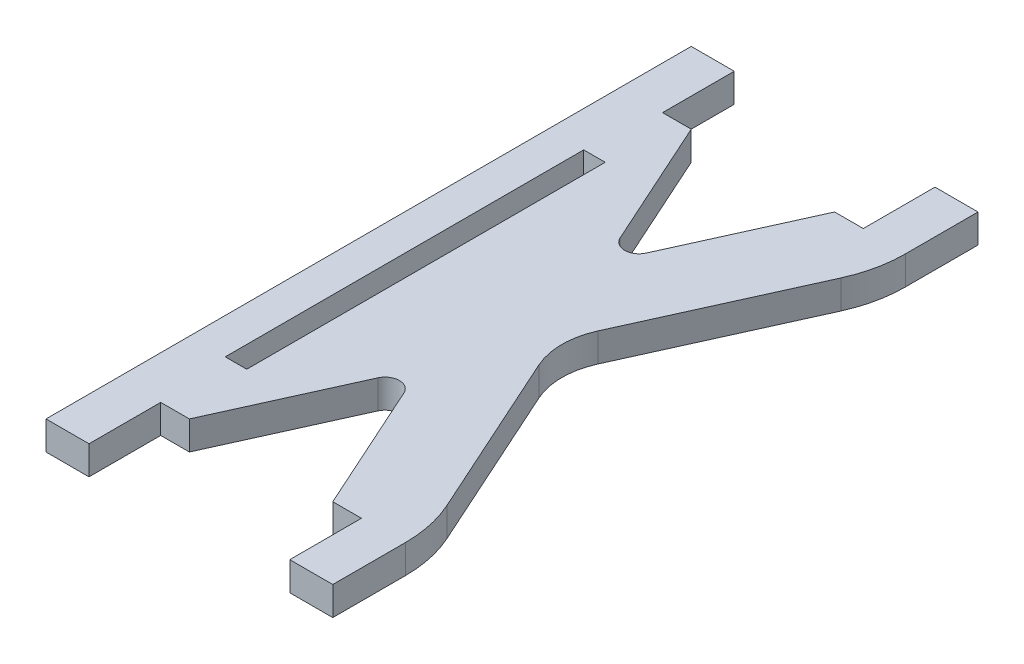
ISO-10303-21;
HEADER;
FILE_DESCRIPTION(('STEP AP214'),'2;1');
FILE_NAME('part.step','',(''),(''),'','','');
FILE_SCHEMA(('AUTOMOTIVE_DESIGN { 1 0 10303 214 1 1 1 1 }'));
ENDSEC;
DATA;
#1=APPLICATION_CONTEXT('core data for automotive mechanical design processes');
#2=APPLICATION_PROTOCOL_DEFINITION('international standard','automotive_design',2000,#1);
#3=PRODUCT_CONTEXT('',#1,'mechanical');
#4=PRODUCT('Part','Part','',(#3));
#5=PRODUCT_RELATED_PRODUCT_CATEGORY('part','',(#4));
#6=PRODUCT_DEFINITION_FORMATION('','',#4);
#7=PRODUCT_DEFINITION_CONTEXT('part definition',#1,'design');
#8=PRODUCT_DEFINITION('design','',#6,#7);
#9=PRODUCT_DEFINITION_SHAPE('','',#8);
#10=(LENGTH_UNIT() NAMED_UNIT(*) SI_UNIT(.MILLI.,.METRE.));
#11=(NAMED_UNIT(*) PLANE_ANGLE_UNIT() SI_UNIT($,.RADIAN.));
#12=(NAMED_UNIT(*) SI_UNIT($,.STERADIAN.) SOLID_ANGLE_UNIT());
#13=UNCERTAINTY_MEASURE_WITH_UNIT(LENGTH_MEASURE(1.E-05),#10,'distance_accuracy_value','');
#14=(GEOMETRIC_REPRESENTATION_CONTEXT(3) GLOBAL_UNCERTAINTY_ASSIGNED_CONTEXT((#13)) GLOBAL_UNIT_ASSIGNED_CONTEXT((#10,
#11,#12)) REPRESENTATION_CONTEXT('',''));
#15=CARTESIAN_POINT('',(0.,0.,0.));
#16=DIRECTION('',(0.,0.,1.));
#17=DIRECTION('',(1.,0.,0.));
#18=AXIS2_PLACEMENT_3D('',#15,#16,#17);
#19=CARTESIAN_POINT('',(0.,2.,5.));
#20=DIRECTION('',(0.,0.,-1.));
#21=DIRECTION('',(-1.,0.,0.));
#22=AXIS2_PLACEMENT_3D('',#19,#20,#21);
#23=PLANE('',#22);
#24=DIRECTION('',(1.,0.,0.));
#25=VECTOR('',#24,1.);
#26=CARTESIAN_POINT('',(0.,0.,5.));
#27=LINE('',#26,#25);
#28=CARTESIAN_POINT('',(0.,0.,5.));
#29=VERTEX_POINT('',#28);
#30=CARTESIAN_POINT('',(3.,0.,5.));
#31=VERTEX_POINT('',#30);
#32=EDGE_CURVE('E264',#29,#31,#27,.T.);
#33=ORIENTED_EDGE('',*,*,#32,.T.);
#34=DIRECTION('',(0.,-1.,0.));
#35=VECTOR('',#34,1.);
#36=CARTESIAN_POINT('',(3.,2.,5.));
#37=LINE('',#36,#35);
#38=CARTESIAN_POINT('',(3.,2.,5.));
#39=VERTEX_POINT('',#38);
#40=EDGE_CURVE('E403',#39,#31,#37,.T.);
#41=ORIENTED_EDGE('',*,*,#40,.F.);
#42=DIRECTION('',(1.,0.,0.));
#43=VECTOR('',#42,1.);
#44=CARTESIAN_POINT('',(0.,2.,5.));
#45=LINE('',#44,#43);
#46=CARTESIAN_POINT('',(0.,2.,5.));
#47=VERTEX_POINT('',#46);
#48=EDGE_CURVE('E268',#47,#39,#45,.T.);
#49=ORIENTED_EDGE('',*,*,#48,.F.);
#50=DIRECTION('',(0.,-1.,0.));
#51=VECTOR('',#50,1.);
#52=CARTESIAN_POINT('',(0.,2.,5.));
#53=LINE('',#52,#51);
#54=EDGE_CURVE('E406',#47,#29,#53,.T.);
#55=ORIENTED_EDGE('',*,*,#54,.T.);
#56=EDGE_LOOP('',(#33,#41,#49,#55));
#57=FACE_BOUND('',#56,.T.);
#58=ADVANCED_FACE('F35',(#57),#23,.F.);
#59=CARTESIAN_POINT('',(3.,2.,0.));
#60=DIRECTION('',(-1.,0.,0.));
#61=DIRECTION('',(0.,0.,1.));
#62=AXIS2_PLACEMENT_3D('',#59,#60,#61);
#63=PLANE('',#62);
#64=DIRECTION('',(0.,0.,-1.));
#65=VECTOR('',#64,1.);
#66=CARTESIAN_POINT('',(3.,0.,0.));
#67=LINE('',#66,#65);
#68=CARTESIAN_POINT('',(3.,0.,0.));
#69=VERTEX_POINT('',#68);
#70=EDGE_CURVE('E317',#31,#69,#67,.T.);
#71=ORIENTED_EDGE('',*,*,#70,.T.);
#72=DIRECTION('',(0.,-1.,0.));
#73=VECTOR('',#72,1.);
#74=CARTESIAN_POINT('',(3.,2.,0.));
#75=LINE('',#74,#73);
#76=CARTESIAN_POINT('',(3.,2.,0.));
#77=VERTEX_POINT('',#76);
#78=EDGE_CURVE('E400',#77,#69,#75,.T.);
#79=ORIENTED_EDGE('',*,*,#78,.F.);
#80=DIRECTION('',(0.,0.,-1.));
#81=VECTOR('',#80,1.);
#82=CARTESIAN_POINT('',(3.,2.,0.));
#83=LINE('',#82,#81);
#84=EDGE_CURVE('E270',#39,#77,#83,.T.);
#85=ORIENTED_EDGE('',*,*,#84,.F.);
#86=ORIENTED_EDGE('',*,*,#40,.T.);
#87=EDGE_LOOP('',(#71,#79,#85,#86));
#88=FACE_BOUND('',#87,.T.);
#89=ADVANCED_FACE('F536',(#88),#63,.F.);
#90=CARTESIAN_POINT('',(3.,2.,0.));
#91=DIRECTION('',(0.,0.,-1.));
#92=DIRECTION('',(-1.,0.,0.));
#93=AXIS2_PLACEMENT_3D('',#90,#91,#92);
#94=PLANE('',#93);
#95=DIRECTION('',(1.,0.,0.));
#96=VECTOR('',#95,1.);
#97=CARTESIAN_POINT('',(3.,0.,0.));
#98=LINE('',#97,#96);
#99=CARTESIAN_POINT('',(5.,0.,0.));
#100=VERTEX_POINT('',#99);
#101=EDGE_CURVE('E319',#69,#100,#98,.T.);
#102=ORIENTED_EDGE('',*,*,#101,.T.);
#103=DIRECTION('',(0.,-1.,0.));
#104=VECTOR('',#103,1.);
#105=CARTESIAN_POINT('',(5.,2.,0.));
#106=LINE('',#105,#104);
#107=CARTESIAN_POINT('',(5.,2.,0.));
#108=VERTEX_POINT('',#107);
#109=EDGE_CURVE('E397',#108,#100,#106,.T.);
#110=ORIENTED_EDGE('',*,*,#109,.F.);
#111=DIRECTION('',(1.,0.,0.));
#112=VECTOR('',#111,1.);
#113=CARTESIAN_POINT('',(3.,2.,0.));
#114=LINE('',#113,#112);
#115=EDGE_CURVE('E273',#77,#108,#114,.T.);
#116=ORIENTED_EDGE('',*,*,#115,.F.);
#117=ORIENTED_EDGE('',*,*,#78,.T.);
#118=EDGE_LOOP('',(#102,#110,#116,#117));
#119=FACE_BOUND('',#118,.T.);
#120=ADVANCED_FACE('F540',(#119),#94,.F.);
#121=CARTESIAN_POINT('',(5.,2.,0.));
#122=DIRECTION('',(-0.911370599658675,0.,-0.411586722426499));
#123=DIRECTION('',(-0.411586722426499,0.,0.911370599658675));
#124=AXIS2_PLACEMENT_3D('',#121,#122,#123);
#125=PLANE('',#124);
#126=DIRECTION('',(0.411586722426499,0.,-0.911370599658675));
#127=VECTOR('',#126,1.);
#128=CARTESIAN_POINT('',(5.,0.,0.));
#129=LINE('',#128,#127);
#130=CARTESIAN_POINT('',(9.08862940034133,0.,-9.05339367218436));
#131=VERTEX_POINT('',#130);
#132=EDGE_CURVE('E321',#100,#131,#129,.T.);
#133=ORIENTED_EDGE('',*,*,#132,.T.);
#134=DIRECTION('',(0.,-1.,0.));
#135=VECTOR('',#134,1.);
#136=CARTESIAN_POINT('',(9.08862940034133,2.,-9.05339367218436));
#137=LINE('',#136,#135);
#138=CARTESIAN_POINT('',(9.08862940034133,2.,-9.05339367218436));
#139=VERTEX_POINT('',#138);
#140=EDGE_CURVE('E412',#131,#139,#137,.F.);
#141=ORIENTED_EDGE('',*,*,#140,.T.);
#142=DIRECTION('',(0.411586722426499,0.,-0.911370599658675));
#143=VECTOR('',#142,1.);
#144=CARTESIAN_POINT('',(5.,2.,0.));
#145=LINE('',#144,#143);
#146=EDGE_CURVE('E275',#108,#139,#145,.T.);
#147=ORIENTED_EDGE('',*,*,#146,.F.);
#148=ORIENTED_EDGE('',*,*,#109,.T.);
#149=EDGE_LOOP('',(#133,#141,#147,#148));
#150=FACE_BOUND('',#149,.T.);
#151=ADVANCED_FACE('F544',(#150),#125,.F.);
#152=CARTESIAN_POINT('',(15.,2.,0.));
#153=DIRECTION('',(0.911370599658675,0.,-0.411586722426499));
#154=DIRECTION('',(-0.411586722426499,0.,-0.911370599658675));
#155=AXIS2_PLACEMENT_3D('',#152,#153,#154);
#156=PLANE('',#155);
#157=DIRECTION('',(0.411586722426499,0.,0.911370599658675));
#158=VECTOR('',#157,1.);
#159=CARTESIAN_POINT('',(15.,2.,0.));
#160=LINE('',#159,#158);
#161=CARTESIAN_POINT('',(10.9113705996587,2.,-9.05339367218436));
#162=VERTEX_POINT('',#161);
#163=CARTESIAN_POINT('',(15.,2.,0.));
#164=VERTEX_POINT('',#163);
#165=EDGE_CURVE('E278',#162,#164,#160,.T.);
#166=ORIENTED_EDGE('',*,*,#165,.F.);
#167=DIRECTION('',(0.,-1.,0.));
#168=VECTOR('',#167,1.);
#169=CARTESIAN_POINT('',(10.9113705996587,0.,-9.05339367218436));
#170=LINE('',#169,#168);
#171=CARTESIAN_POINT('',(10.9113705996587,0.,-9.05339367218436));
#172=VERTEX_POINT('',#171);
#173=EDGE_CURVE('E409',#162,#172,#170,.T.);
#174=ORIENTED_EDGE('',*,*,#173,.T.);
#175=DIRECTION('',(0.411586722426499,0.,0.911370599658675));
#176=VECTOR('',#175,1.);
#177=CARTESIAN_POINT('',(15.,0.,0.));
#178=LINE('',#177,#176);
#179=CARTESIAN_POINT('',(15.,0.,0.));
#180=VERTEX_POINT('',#179);
#181=EDGE_CURVE('E324',#172,#180,#178,.T.);
#182=ORIENTED_EDGE('',*,*,#181,.T.);
#183=DIRECTION('',(0.,-1.,0.));
#184=VECTOR('',#183,1.);
#185=CARTESIAN_POINT('',(15.,2.,0.));
#186=LINE('',#185,#184);
#187=EDGE_CURVE('E394',#164,#180,#186,.T.);
#188=ORIENTED_EDGE('',*,*,#187,.F.);
#189=EDGE_LOOP('',(#166,#174,#182,#188));
#190=FACE_BOUND('',#189,.T.);
#191=ADVANCED_FACE('F553',(#190),#156,.F.);
#192=CARTESIAN_POINT('',(15.,2.,0.));
#193=DIRECTION('',(0.,0.,-1.));
#194=DIRECTION('',(-1.,0.,0.));
#195=AXIS2_PLACEMENT_3D('',#192,#193,#194);
#196=PLANE('',#195);
#197=DIRECTION('',(1.,0.,0.));
#198=VECTOR('',#197,1.);
#199=CARTESIAN_POINT('',(15.,0.,0.));
#200=LINE('',#199,#198);
#201=CARTESIAN_POINT('',(17.,0.,0.));
#202=VERTEX_POINT('',#201);
#203=EDGE_CURVE('E326',#180,#202,#200,.T.);
#204=ORIENTED_EDGE('',*,*,#203,.T.);
#205=DIRECTION('',(0.,-1.,0.));
#206=VECTOR('',#205,1.);
#207=CARTESIAN_POINT('',(17.,2.,0.));
#208=LINE('',#207,#206);
#209=CARTESIAN_POINT('',(17.,2.,0.));
#210=VERTEX_POINT('',#209);
#211=EDGE_CURVE('E391',#210,#202,#208,.T.);
#212=ORIENTED_EDGE('',*,*,#211,.F.);
#213=DIRECTION('',(1.,0.,0.));
#214=VECTOR('',#213,1.);
#215=CARTESIAN_POINT('',(15.,2.,0.));
#216=LINE('',#215,#214);
#217=EDGE_CURVE('E280',#164,#210,#216,.T.);
#218=ORIENTED_EDGE('',*,*,#217,.F.);
#219=ORIENTED_EDGE('',*,*,#187,.T.);
#220=EDGE_LOOP('',(#204,#212,#218,#219));
#221=FACE_BOUND('',#220,.T.);
#222=ADVANCED_FACE('F560',(#221),#196,.F.);
#223=CARTESIAN_POINT('',(17.,2.,0.));
#224=DIRECTION('',(1.,0.,0.));
#225=DIRECTION('',(0.,0.,-1.));
#226=AXIS2_PLACEMENT_3D('',#223,#224,#225);
#227=PLANE('',#226);
#228=DIRECTION('',(0.,0.,1.));
#229=VECTOR('',#228,1.);
#230=CARTESIAN_POINT('',(17.,0.,0.));
#231=LINE('',#230,#229);
#232=CARTESIAN_POINT('',(17.,0.,5.));
#233=VERTEX_POINT('',#232);
#234=EDGE_CURVE('E328',#202,#233,#231,.T.);
#235=ORIENTED_EDGE('',*,*,#234,.T.);
#236=DIRECTION('',(0.,-1.,0.));
#237=VECTOR('',#236,1.);
#238=CARTESIAN_POINT('',(17.,2.,5.));
#239=LINE('',#238,#237);
#240=CARTESIAN_POINT('',(17.,2.,5.));
#241=VERTEX_POINT('',#240);
#242=EDGE_CURVE('E388',#241,#233,#239,.T.);
#243=ORIENTED_EDGE('',*,*,#242,.F.);
#244=DIRECTION('',(0.,0.,1.));
#245=VECTOR('',#244,1.);
#246=CARTESIAN_POINT('',(17.,2.,0.));
#247=LINE('',#246,#245);
#248=EDGE_CURVE('E282',#210,#241,#247,.T.);
#249=ORIENTED_EDGE('',*,*,#248,.F.);
#250=ORIENTED_EDGE('',*,*,#211,.T.);
#251=EDGE_LOOP('',(#235,#243,#249,#250));
#252=FACE_BOUND('',#251,.T.);
#253=ADVANCED_FACE('F564',(#252),#227,.F.);
#254=CARTESIAN_POINT('',(20.,2.,5.));
#255=DIRECTION('',(0.,0.,-1.));
#256=DIRECTION('',(-1.,0.,0.));
#257=AXIS2_PLACEMENT_3D('',#254,#255,#256);
#258=PLANE('',#257);
#259=DIRECTION('',(1.,0.,0.));
#260=VECTOR('',#259,1.);
#261=CARTESIAN_POINT('',(20.,0.,5.));
#262=LINE('',#261,#260);
#263=CARTESIAN_POINT('',(20.,0.,5.));
#264=VERTEX_POINT('',#263);
#265=EDGE_CURVE('E330',#233,#264,#262,.T.);
#266=ORIENTED_EDGE('',*,*,#265,.T.);
#267=DIRECTION('',(0.,-1.,0.));
#268=VECTOR('',#267,1.);
#269=CARTESIAN_POINT('',(20.,2.,5.));
#270=LINE('',#269,#268);
#271=CARTESIAN_POINT('',(20.,2.,5.));
#272=VERTEX_POINT('',#271);
#273=EDGE_CURVE('E385',#272,#264,#270,.T.);
#274=ORIENTED_EDGE('',*,*,#273,.F.);
#275=DIRECTION('',(1.,0.,0.));
#276=VECTOR('',#275,1.);
#277=CARTESIAN_POINT('',(20.,2.,5.));
#278=LINE('',#277,#276);
#279=EDGE_CURVE('E284',#241,#272,#278,.T.);
#280=ORIENTED_EDGE('',*,*,#279,.F.);
#281=ORIENTED_EDGE('',*,*,#242,.T.);
#282=EDGE_LOOP('',(#266,#274,#280,#281));
#283=FACE_BOUND('',#282,.T.);
#284=ADVANCED_FACE('F570',(#283),#258,.F.);
#285=CARTESIAN_POINT('',(20.,2.,0.));
#286=DIRECTION('',(-1.,0.,0.));
#287=DIRECTION('',(0.,0.,1.));
#288=AXIS2_PLACEMENT_3D('',#285,#286,#287);
#289=PLANE('',#288);
#290=DIRECTION('',(0.,0.,-1.));
#291=VECTOR('',#290,1.);
#292=CARTESIAN_POINT('',(20.,0.,0.));
#293=LINE('',#292,#291);
#294=CARTESIAN_POINT('',(20.,0.,-0.0619768335350678));
#295=VERTEX_POINT('',#294);
#296=EDGE_CURVE('E333',#264,#295,#293,.T.);
#297=ORIENTED_EDGE('',*,*,#296,.T.);
#298=DIRECTION('',(0.,-1.,0.));
#299=VECTOR('',#298,1.);
#300=CARTESIAN_POINT('',(20.,2.,-0.0619768335350678));
#301=LINE('',#300,#299);
#302=CARTESIAN_POINT('',(20.,2.,-0.0619768335350678));
#303=VERTEX_POINT('',#302);
#304=EDGE_CURVE('E11',#295,#303,#301,.F.);
#305=ORIENTED_EDGE('',*,*,#304,.T.);
#306=DIRECTION('',(0.,0.,-1.));
#307=VECTOR('',#306,1.);
#308=CARTESIAN_POINT('',(20.,2.,0.));
#309=LINE('',#308,#307);
#310=EDGE_CURVE('E286',#272,#303,#309,.T.);
#311=ORIENTED_EDGE('',*,*,#310,.F.);
#312=ORIENTED_EDGE('',*,*,#273,.T.);
#313=EDGE_LOOP('',(#297,#305,#311,#312));
#314=FACE_BOUND('',#313,.T.);
#315=ADVANCED_FACE('F572',(#314),#289,.F.);
#316=CARTESIAN_POINT('',(20.,2.,-2.));
#317=DIRECTION('',(-0.911370599658675,0.,0.411586722426498));
#318=DIRECTION('',(0.411586722426498,0.,0.911370599658675));
#319=AXIS2_PLACEMENT_3D('',#316,#317,#318);
#320=PLANE('',#319);
#321=DIRECTION('',(-0.411586722426498,0.,-0.911370599658675));
#322=VECTOR('',#321,1.);
#323=CARTESIAN_POINT('',(20.,2.,-2.));
#324=LINE('',#323,#322);
#325=CARTESIAN_POINT('',(19.2023353969281,2.,-3.76625733537355));
#326=VERTEX_POINT('',#325);
#327=CARTESIAN_POINT('',(13.9293893732211,2.,-15.4420663878675));
#328=VERTEX_POINT('',#327);
#329=EDGE_CURVE('E289',#326,#328,#324,.T.);
#330=ORIENTED_EDGE('',*,*,#329,.F.);
#331=DIRECTION('',(0.,-1.,0.));
#332=VECTOR('',#331,1.);
#333=CARTESIAN_POINT('',(19.2023353969281,2.,-3.76625733537355));
#334=LINE('',#333,#332);
#335=CARTESIAN_POINT('',(19.2023353969281,0.,-3.76625733537355));
#336=VERTEX_POINT('',#335);
#337=EDGE_CURVE('E43',#326,#336,#334,.T.);
#338=ORIENTED_EDGE('',*,*,#337,.T.);
#339=DIRECTION('',(-0.411586722426498,0.,-0.911370599658675));
#340=VECTOR('',#339,1.);
#341=CARTESIAN_POINT('',(20.,0.,-2.));
#342=LINE('',#341,#340);
#343=CARTESIAN_POINT('',(13.9293893732211,0.,-15.4420663878675));
#344=VERTEX_POINT('',#343);
#345=EDGE_CURVE('E336',#336,#344,#342,.T.);
#346=ORIENTED_EDGE('',*,*,#345,.T.);
#347=DIRECTION('',(0.,-1.,0.));
#348=VECTOR('',#347,1.);
#349=CARTESIAN_POINT('',(13.9293893732211,2.,-15.4420663878675));
#350=LINE('',#349,#348);
#351=EDGE_CURVE('E430',#344,#328,#350,.F.);
#352=ORIENTED_EDGE('',*,*,#351,.T.);
#353=EDGE_LOOP('',(#330,#338,#346,#352));
#354=FACE_BOUND('',#353,.T.);
#355=ADVANCED_FACE('F455',(#354),#320,.F.);
#356=CARTESIAN_POINT('',(20.,2.,-33.));
#357=DIRECTION('',(-0.911370599658675,0.,-0.411586722426498));
#358=DIRECTION('',(-0.411586722426498,0.,0.911370599658675));
#359=AXIS2_PLACEMENT_3D('',#356,#357,#358);
#360=PLANE('',#359);
#361=DIRECTION('',(0.411586722426498,0.,-0.911370599658675));
#362=VECTOR('',#361,1.);
#363=CARTESIAN_POINT('',(20.,0.,-33.));
#364=LINE('',#363,#362);
#365=CARTESIAN_POINT('',(13.9293893732211,0.,-19.5579336121325));
#366=VERTEX_POINT('',#365);
#367=CARTESIAN_POINT('',(19.2023353969281,0.,-31.2337426646264));
#368=VERTEX_POINT('',#367);
#369=EDGE_CURVE('E338',#366,#368,#364,.T.);
#370=ORIENTED_EDGE('',*,*,#369,.T.);
#371=DIRECTION('',(0.,-1.,0.));
#372=VECTOR('',#371,1.);
#373=CARTESIAN_POINT('',(19.2023353969281,2.,-31.2337426646264));
#374=LINE('',#373,#372);
#375=CARTESIAN_POINT('',(19.2023353969281,2.,-31.2337426646264));
#376=VERTEX_POINT('',#375);
#377=EDGE_CURVE('E445',#368,#376,#374,.F.);
#378=ORIENTED_EDGE('',*,*,#377,.T.);
#379=DIRECTION('',(0.411586722426498,0.,-0.911370599658675));
#380=VECTOR('',#379,1.);
#381=CARTESIAN_POINT('',(20.,2.,-33.));
#382=LINE('',#381,#380);
#383=CARTESIAN_POINT('',(13.9293893732211,2.,-19.5579336121325));
#384=VERTEX_POINT('',#383);
#385=EDGE_CURVE('E291',#384,#376,#382,.T.);
#386=ORIENTED_EDGE('',*,*,#385,.F.);
#387=DIRECTION('',(0.,-1.,0.));
#388=VECTOR('',#387,1.);
#389=CARTESIAN_POINT('',(13.9293893732211,0.,-19.5579336121325));
#390=LINE('',#389,#388);
#391=EDGE_CURVE('E427',#384,#366,#390,.T.);
#392=ORIENTED_EDGE('',*,*,#391,.T.);
#393=EDGE_LOOP('',(#370,#378,#386,#392));
#394=FACE_BOUND('',#393,.T.);
#395=ADVANCED_FACE('F470',(#394),#360,.F.);
#396=CARTESIAN_POINT('',(20.,2.,-35.));
#397=DIRECTION('',(-1.,0.,0.));
#398=DIRECTION('',(0.,0.,1.));
#399=AXIS2_PLACEMENT_3D('',#396,#397,#398);
#400=PLANE('',#399);
#401=DIRECTION('',(0.,0.,-1.));
#402=VECTOR('',#401,1.);
#403=CARTESIAN_POINT('',(20.,2.,-33.));
#404=LINE('',#403,#402);
#405=CARTESIAN_POINT('',(20.,2.,-34.9380231664649));
#406=VERTEX_POINT('',#405);
#407=CARTESIAN_POINT('',(20.,2.,-40.));
#408=VERTEX_POINT('',#407);
#409=EDGE_CURVE('E294',#406,#408,#404,.T.);
#410=ORIENTED_EDGE('',*,*,#409,.F.);
#411=DIRECTION('',(0.,-1.,0.));
#412=VECTOR('',#411,1.);
#413=CARTESIAN_POINT('',(20.,2.,-34.9380231664649));
#414=LINE('',#413,#412);
#415=CARTESIAN_POINT('',(20.,0.,-34.9380231664649));
#416=VERTEX_POINT('',#415);
#417=EDGE_CURVE('E438',#406,#416,#414,.T.);
#418=ORIENTED_EDGE('',*,*,#417,.T.);
#419=DIRECTION('',(0.,0.,-1.));
#420=VECTOR('',#419,1.);
#421=CARTESIAN_POINT('',(20.,0.,-35.));
#422=LINE('',#421,#420);
#423=CARTESIAN_POINT('',(20.,0.,-40.));
#424=VERTEX_POINT('',#423);
#425=EDGE_CURVE('E341',#416,#424,#422,.T.);
#426=ORIENTED_EDGE('',*,*,#425,.T.);
#427=DIRECTION('',(0.,-1.,0.));
#428=VECTOR('',#427,1.);
#429=CARTESIAN_POINT('',(20.,2.,-40.));
#430=LINE('',#429,#428);
#431=EDGE_CURVE('E382',#408,#424,#430,.T.);
#432=ORIENTED_EDGE('',*,*,#431,.F.);
#433=EDGE_LOOP('',(#410,#418,#426,#432));
#434=FACE_BOUND('',#433,.T.);
#435=ADVANCED_FACE('F478',(#434),#400,.F.);
#436=CARTESIAN_POINT('',(20.,2.,-40.));
#437=DIRECTION('',(0.,0.,1.));
#438=DIRECTION('',(1.,0.,0.));
#439=AXIS2_PLACEMENT_3D('',#436,#437,#438);
#440=PLANE('',#439);
#441=DIRECTION('',(-1.,0.,0.));
#442=VECTOR('',#441,1.);
#443=CARTESIAN_POINT('',(20.,0.,-40.));
#444=LINE('',#443,#442);
#445=CARTESIAN_POINT('',(17.,0.,-40.));
#446=VERTEX_POINT('',#445);
#447=EDGE_CURVE('E343',#424,#446,#444,.T.);
#448=ORIENTED_EDGE('',*,*,#447,.T.);
#449=DIRECTION('',(0.,-1.,0.));
#450=VECTOR('',#449,1.);
#451=CARTESIAN_POINT('',(17.,2.,-40.));
#452=LINE('',#451,#450);
#453=CARTESIAN_POINT('',(17.,2.,-40.));
#454=VERTEX_POINT('',#453);
#455=EDGE_CURVE('E379',#454,#446,#452,.T.);
#456=ORIENTED_EDGE('',*,*,#455,.F.);
#457=DIRECTION('',(-1.,0.,0.));
#458=VECTOR('',#457,1.);
#459=CARTESIAN_POINT('',(20.,2.,-40.));
#460=LINE('',#459,#458);
#461=EDGE_CURVE('E296',#408,#454,#460,.T.);
#462=ORIENTED_EDGE('',*,*,#461,.F.);
#463=ORIENTED_EDGE('',*,*,#431,.T.);
#464=EDGE_LOOP('',(#448,#456,#462,#463));
#465=FACE_BOUND('',#464,.T.);
#466=ADVANCED_FACE('F484',(#465),#440,.F.);
#467=CARTESIAN_POINT('',(17.,2.,-35.));
#468=DIRECTION('',(1.,0.,0.));
#469=DIRECTION('',(0.,0.,-1.));
#470=AXIS2_PLACEMENT_3D('',#467,#468,#469);
#471=PLANE('',#470);
#472=DIRECTION('',(0.,0.,1.));
#473=VECTOR('',#472,1.);
#474=CARTESIAN_POINT('',(17.,0.,-35.));
#475=LINE('',#474,#473);
#476=CARTESIAN_POINT('',(17.,0.,-35.));
#477=VERTEX_POINT('',#476);
#478=EDGE_CURVE('E345',#446,#477,#475,.T.);
#479=ORIENTED_EDGE('',*,*,#478,.T.);
#480=DIRECTION('',(0.,-1.,0.));
#481=VECTOR('',#480,1.);
#482=CARTESIAN_POINT('',(17.,2.,-35.));
#483=LINE('',#482,#481);
#484=CARTESIAN_POINT('',(17.,2.,-35.));
#485=VERTEX_POINT('',#484);
#486=EDGE_CURVE('E376',#485,#477,#483,.T.);
#487=ORIENTED_EDGE('',*,*,#486,.F.);
#488=DIRECTION('',(0.,0.,1.));
#489=VECTOR('',#488,1.);
#490=CARTESIAN_POINT('',(17.,2.,-35.));
#491=LINE('',#490,#489);
#492=EDGE_CURVE('E298',#454,#485,#491,.T.);
#493=ORIENTED_EDGE('',*,*,#492,.F.);
#494=ORIENTED_EDGE('',*,*,#455,.T.);
#495=EDGE_LOOP('',(#479,#487,#493,#494));
#496=FACE_BOUND('',#495,.T.);
#497=ADVANCED_FACE('F490',(#496),#471,.F.);
#498=CARTESIAN_POINT('',(15.,2.,-35.));
#499=DIRECTION('',(0.,0.,1.));
#500=DIRECTION('',(1.,0.,0.));
#501=AXIS2_PLACEMENT_3D('',#498,#499,#500);
#502=PLANE('',#501);
#503=DIRECTION('',(-1.,0.,0.));
#504=VECTOR('',#503,1.);
#505=CARTESIAN_POINT('',(15.,0.,-35.));
#506=LINE('',#505,#504);
#507=CARTESIAN_POINT('',(15.,0.,-35.));
#508=VERTEX_POINT('',#507);
#509=EDGE_CURVE('E347',#477,#508,#506,.T.);
#510=ORIENTED_EDGE('',*,*,#509,.T.);
#511=DIRECTION('',(0.,-1.,0.));
#512=VECTOR('',#511,1.);
#513=CARTESIAN_POINT('',(15.,2.,-35.));
#514=LINE('',#513,#512);
#515=CARTESIAN_POINT('',(15.,2.,-35.));
#516=VERTEX_POINT('',#515);
#517=EDGE_CURVE('E373',#516,#508,#514,.T.);
#518=ORIENTED_EDGE('',*,*,#517,.F.);
#519=DIRECTION('',(-1.,0.,0.));
#520=VECTOR('',#519,1.);
#521=CARTESIAN_POINT('',(15.,2.,-35.));
#522=LINE('',#521,#520);
#523=EDGE_CURVE('E300',#485,#516,#522,.T.);
#524=ORIENTED_EDGE('',*,*,#523,.F.);
#525=ORIENTED_EDGE('',*,*,#486,.T.);
#526=EDGE_LOOP('',(#510,#518,#524,#525));
#527=FACE_BOUND('',#526,.T.);
#528=ADVANCED_FACE('F494',(#527),#502,.F.);
#529=CARTESIAN_POINT('',(15.,2.,-35.));
#530=DIRECTION('',(0.911370599658675,0.,0.411586722426499));
#531=DIRECTION('',(0.411586722426499,0.,-0.911370599658675));
#532=AXIS2_PLACEMENT_3D('',#529,#530,#531);
#533=PLANE('',#532);
#534=DIRECTION('',(-0.411586722426499,0.,0.911370599658675));
#535=VECTOR('',#534,1.);
#536=CARTESIAN_POINT('',(15.,0.,-35.));
#537=LINE('',#536,#535);
#538=CARTESIAN_POINT('',(10.9113705996587,0.,-25.9466063278156));
#539=VERTEX_POINT('',#538);
#540=EDGE_CURVE('E349',#508,#539,#537,.T.);
#541=ORIENTED_EDGE('',*,*,#540,.T.);
#542=DIRECTION('',(0.,-1.,0.));
#543=VECTOR('',#542,1.);
#544=CARTESIAN_POINT('',(10.9113705996587,2.,-25.9466063278156));
#545=LINE('',#544,#543);
#546=CARTESIAN_POINT('',(10.9113705996587,2.,-25.9466063278156));
#547=VERTEX_POINT('',#546);
#548=EDGE_CURVE('E417',#539,#547,#545,.F.);
#549=ORIENTED_EDGE('',*,*,#548,.T.);
#550=DIRECTION('',(-0.411586722426499,0.,0.911370599658675));
#551=VECTOR('',#550,1.);
#552=CARTESIAN_POINT('',(15.,2.,-35.));
#553=LINE('',#552,#551);
#554=EDGE_CURVE('E302',#516,#547,#553,.T.);
#555=ORIENTED_EDGE('',*,*,#554,.F.);
#556=ORIENTED_EDGE('',*,*,#517,.T.);
#557=EDGE_LOOP('',(#541,#549,#555,#556));
#558=FACE_BOUND('',#557,.T.);
#559=ADVANCED_FACE('F498',(#558),#533,.F.);
#560=CARTESIAN_POINT('',(5.,2.,-35.));
#561=DIRECTION('',(-0.911370599658675,0.,0.411586722426499));
#562=DIRECTION('',(0.411586722426499,0.,0.911370599658675));
#563=AXIS2_PLACEMENT_3D('',#560,#561,#562);
#564=PLANE('',#563);
#565=DIRECTION('',(-0.411586722426499,0.,-0.911370599658675));
#566=VECTOR('',#565,1.);
#567=CARTESIAN_POINT('',(5.,2.,-35.));
#568=LINE('',#567,#566);
#569=CARTESIAN_POINT('',(9.08862940034133,2.,-25.9466063278156));
#570=VERTEX_POINT('',#569);
#571=CARTESIAN_POINT('',(5.,2.,-35.));
#572=VERTEX_POINT('',#571);
#573=EDGE_CURVE('E305',#570,#572,#568,.T.);
#574=ORIENTED_EDGE('',*,*,#573,.F.);
#575=DIRECTION('',(0.,-1.,0.));
#576=VECTOR('',#575,1.);
#577=CARTESIAN_POINT('',(9.08862940034132,0.,-25.9466063278156));
#578=LINE('',#577,#576);
#579=CARTESIAN_POINT('',(9.08862940034133,0.,-25.9466063278156));
#580=VERTEX_POINT('',#579);
#581=EDGE_CURVE('E414',#570,#580,#578,.T.);
#582=ORIENTED_EDGE('',*,*,#581,.T.);
#583=DIRECTION('',(-0.411586722426499,0.,-0.911370599658675));
#584=VECTOR('',#583,1.);
#585=CARTESIAN_POINT('',(5.,0.,-35.));
#586=LINE('',#585,#584);
#587=CARTESIAN_POINT('',(5.,0.,-35.));
#588=VERTEX_POINT('',#587);
#589=EDGE_CURVE('E352',#580,#588,#586,.T.);
#590=ORIENTED_EDGE('',*,*,#589,.T.);
#591=DIRECTION('',(0.,-1.,0.));
#592=VECTOR('',#591,1.);
#593=CARTESIAN_POINT('',(5.,2.,-35.));
#594=LINE('',#593,#592);
#595=EDGE_CURVE('E370',#572,#588,#594,.T.);
#596=ORIENTED_EDGE('',*,*,#595,.F.);
#597=EDGE_LOOP('',(#574,#582,#590,#596));
#598=FACE_BOUND('',#597,.T.);
#599=ADVANCED_FACE('F507',(#598),#564,.F.);
#600=CARTESIAN_POINT('',(3.,2.,-35.));
#601=DIRECTION('',(0.,0.,1.));
#602=DIRECTION('',(1.,0.,0.));
#603=AXIS2_PLACEMENT_3D('',#600,#601,#602);
#604=PLANE('',#603);
#605=DIRECTION('',(-1.,0.,0.));
#606=VECTOR('',#605,1.);
#607=CARTESIAN_POINT('',(3.,0.,-35.));
#608=LINE('',#607,#606);
#609=CARTESIAN_POINT('',(3.,0.,-35.));
#610=VERTEX_POINT('',#609);
#611=EDGE_CURVE('E354',#588,#610,#608,.T.);
#612=ORIENTED_EDGE('',*,*,#611,.T.);
#613=DIRECTION('',(0.,-1.,0.));
#614=VECTOR('',#613,1.);
#615=CARTESIAN_POINT('',(3.,2.,-35.));
#616=LINE('',#615,#614);
#617=CARTESIAN_POINT('',(3.,2.,-35.));
#618=VERTEX_POINT('',#617);
#619=EDGE_CURVE('E367',#618,#610,#616,.T.);
#620=ORIENTED_EDGE('',*,*,#619,.F.);
#621=DIRECTION('',(-1.,0.,0.));
#622=VECTOR('',#621,1.);
#623=CARTESIAN_POINT('',(3.,2.,-35.));
#624=LINE('',#623,#622);
#625=EDGE_CURVE('E307',#572,#618,#624,.T.);
#626=ORIENTED_EDGE('',*,*,#625,.F.);
#627=ORIENTED_EDGE('',*,*,#595,.T.);
#628=EDGE_LOOP('',(#612,#620,#626,#627));
#629=FACE_BOUND('',#628,.T.);
#630=ADVANCED_FACE('F513',(#629),#604,.F.);
#631=CARTESIAN_POINT('',(3.,2.,-35.));
#632=DIRECTION('',(-1.,0.,0.));
#633=DIRECTION('',(0.,0.,1.));
#634=AXIS2_PLACEMENT_3D('',#631,#632,#633);
#635=PLANE('',#634);
#636=DIRECTION('',(0.,0.,-1.));
#637=VECTOR('',#636,1.);
#638=CARTESIAN_POINT('',(3.,0.,-35.));
#639=LINE('',#638,#637);
#640=CARTESIAN_POINT('',(3.,0.,-40.));
#641=VERTEX_POINT('',#640);
#642=EDGE_CURVE('E356',#610,#641,#639,.T.);
#643=ORIENTED_EDGE('',*,*,#642,.T.);
#644=DIRECTION('',(0.,-1.,0.));
#645=VECTOR('',#644,1.);
#646=CARTESIAN_POINT('',(3.,2.,-40.));
#647=LINE('',#646,#645);
#648=CARTESIAN_POINT('',(3.,2.,-40.));
#649=VERTEX_POINT('',#648);
#650=EDGE_CURVE('E364',#649,#641,#647,.T.);
#651=ORIENTED_EDGE('',*,*,#650,.F.);
#652=DIRECTION('',(0.,0.,-1.));
#653=VECTOR('',#652,1.);
#654=CARTESIAN_POINT('',(3.,2.,-35.));
#655=LINE('',#654,#653);
#656=EDGE_CURVE('E309',#618,#649,#655,.T.);
#657=ORIENTED_EDGE('',*,*,#656,.F.);
#658=ORIENTED_EDGE('',*,*,#619,.T.);
#659=EDGE_LOOP('',(#643,#651,#657,#658));
#660=FACE_BOUND('',#659,.T.);
#661=ADVANCED_FACE('F517',(#660),#635,.F.);
#662=CARTESIAN_POINT('',(0.,2.,-40.));
#663=DIRECTION('',(0.,0.,1.));
#664=DIRECTION('',(1.,0.,0.));
#665=AXIS2_PLACEMENT_3D('',#662,#663,#664);
#666=PLANE('',#665);
#667=DIRECTION('',(-1.,0.,0.));
#668=VECTOR('',#667,1.);
#669=CARTESIAN_POINT('',(0.,0.,-40.));
#670=LINE('',#669,#668);
#671=CARTESIAN_POINT('',(0.,0.,-40.));
#672=VERTEX_POINT('',#671);
#673=EDGE_CURVE('E358',#641,#672,#670,.T.);
#674=ORIENTED_EDGE('',*,*,#673,.T.);
#675=DIRECTION('',(0.,-1.,0.));
#676=VECTOR('',#675,1.);
#677=CARTESIAN_POINT('',(0.,2.,-40.));
#678=LINE('',#677,#676);
#679=CARTESIAN_POINT('',(0.,2.,-40.));
#680=VERTEX_POINT('',#679);
#681=EDGE_CURVE('E315',#680,#672,#678,.T.);
#682=ORIENTED_EDGE('',*,*,#681,.F.);
#683=DIRECTION('',(-1.,0.,0.));
#684=VECTOR('',#683,1.);
#685=CARTESIAN_POINT('',(0.,2.,-40.));
#686=LINE('',#685,#684);
#687=EDGE_CURVE('E311',#649,#680,#686,.T.);
#688=ORIENTED_EDGE('',*,*,#687,.F.);
#689=ORIENTED_EDGE('',*,*,#650,.T.);
#690=EDGE_LOOP('',(#674,#682,#688,#689));
#691=FACE_BOUND('',#690,.T.);
#692=ADVANCED_FACE('F524',(#691),#666,.F.);
#693=CARTESIAN_POINT('',(0.,2.,0.));
#694=DIRECTION('',(1.,0.,0.));
#695=DIRECTION('',(0.,0.,-1.));
#696=AXIS2_PLACEMENT_3D('',#693,#694,#695);
#697=PLANE('',#696);
#698=ORIENTED_EDGE('',*,*,#54,.F.);
#699=DIRECTION('',(0.,0.,1.));
#700=VECTOR('',#699,1.);
#701=CARTESIAN_POINT('',(0.,2.,-35.));
#702=LINE('',#701,#700);
#703=EDGE_CURVE('E313',#680,#47,#702,.T.);
#704=ORIENTED_EDGE('',*,*,#703,.F.);
#705=ORIENTED_EDGE('',*,*,#681,.T.);
#706=DIRECTION('',(0.,0.,1.));
#707=VECTOR('',#706,1.);
#708=CARTESIAN_POINT('',(0.,0.,-33.));
#709=LINE('',#708,#707);
#710=EDGE_CURVE('E271',#672,#29,#709,.T.);
#711=ORIENTED_EDGE('',*,*,#710,.T.);
#712=EDGE_LOOP('',(#698,#704,#705,#711));
#713=FACE_BOUND('',#712,.T.);
#714=ADVANCED_FACE('F527',(#713),#697,.F.);
#715=CARTESIAN_POINT('',(0.,2.,0.));
#716=DIRECTION('',(0.,1.,0.));
#717=DIRECTION('',(0.,0.,1.));
#718=AXIS2_PLACEMENT_3D('',#715,#716,#717);
#719=PLANE('',#718);
#720=DIRECTION('',(0.,0.,-1.));
#721=VECTOR('',#720,1.);
#722=CARTESIAN_POINT('',(4.00000000000001,2.,-5.));
#723=LINE('',#722,#721);
#724=CARTESIAN_POINT('',(4.00000000000001,2.,-5.));
#725=VERTEX_POINT('',#724);
#726=CARTESIAN_POINT('',(4.00000000000001,2.,-30.));
#727=VERTEX_POINT('',#726);
#728=EDGE_CURVE('E50',#725,#727,#723,.T.);
#729=ORIENTED_EDGE('',*,*,#728,.F.);
#730=DIRECTION('',(1.,0.,0.));
#731=VECTOR('',#730,1.);
#732=CARTESIAN_POINT('',(2.5,2.,-5.));
#733=LINE('',#732,#731);
#734=CARTESIAN_POINT('',(2.5,2.,-5.));
#735=VERTEX_POINT('',#734);
#736=EDGE_CURVE('E249',#735,#725,#733,.T.);
#737=ORIENTED_EDGE('',*,*,#736,.F.);
#738=DIRECTION('',(0.,0.,1.));
#739=VECTOR('',#738,1.);
#740=CARTESIAN_POINT('',(2.5,2.,-5.));
#741=LINE('',#740,#739);
#742=CARTESIAN_POINT('',(2.5,2.,-30.));
#743=VERTEX_POINT('',#742);
#744=EDGE_CURVE('E252',#743,#735,#741,.T.);
#745=ORIENTED_EDGE('',*,*,#744,.F.);
#746=DIRECTION('',(-1.,0.,0.));
#747=VECTOR('',#746,1.);
#748=CARTESIAN_POINT('',(2.5,2.,-30.));
#749=LINE('',#748,#747);
#750=EDGE_CURVE('E258',#727,#743,#749,.T.);
#751=ORIENTED_EDGE('',*,*,#750,.F.);
#752=EDGE_LOOP('',(#729,#737,#745,#751));
#753=FACE_BOUND('',#752,.T.);
#754=ORIENTED_EDGE('',*,*,#625,.T.);
#755=ORIENTED_EDGE('',*,*,#656,.T.);
#756=ORIENTED_EDGE('',*,*,#687,.T.);
#757=ORIENTED_EDGE('',*,*,#703,.T.);
#758=ORIENTED_EDGE('',*,*,#48,.T.);
#759=ORIENTED_EDGE('',*,*,#84,.T.);
#760=ORIENTED_EDGE('',*,*,#115,.T.);
#761=ORIENTED_EDGE('',*,*,#146,.T.);
#762=CARTESIAN_POINT('',(10.,2.,-8.64180694975786));
#763=DIRECTION('',(0.,1.,0.));
#764=DIRECTION('',(0.,0.,1.));
#765=AXIS2_PLACEMENT_3D('',#762,#763,#764);
#766=CIRCLE('',#765,1.);
#767=EDGE_CURVE('E421',#139,#162,#766,.F.);
#768=ORIENTED_EDGE('',*,*,#767,.T.);
#769=ORIENTED_EDGE('',*,*,#165,.T.);
#770=ORIENTED_EDGE('',*,*,#217,.T.);
#771=ORIENTED_EDGE('',*,*,#248,.T.);
#772=ORIENTED_EDGE('',*,*,#279,.T.);
#773=ORIENTED_EDGE('',*,*,#310,.T.);
#774=CARTESIAN_POINT('',(11.,2.,-0.0619768335350678));
#775=DIRECTION('',(0.,1.,0.));
#776=DIRECTION('',(0.,0.,1.));
#777=AXIS2_PLACEMENT_3D('',#774,#775,#776);
#778=CIRCLE('',#777,9.);
#779=EDGE_CURVE('E447',#303,#326,#778,.T.);
#780=ORIENTED_EDGE('',*,*,#779,.T.);
#781=ORIENTED_EDGE('',*,*,#329,.T.);
#782=CARTESIAN_POINT('',(18.4862423715145,2.,-17.5));
#783=DIRECTION('',(0.,1.,0.));
#784=DIRECTION('',(0.,0.,1.));
#785=AXIS2_PLACEMENT_3D('',#782,#783,#784);
#786=CIRCLE('',#785,5.);
#787=EDGE_CURVE('E436',#328,#384,#786,.F.);
#788=ORIENTED_EDGE('',*,*,#787,.T.);
#789=ORIENTED_EDGE('',*,*,#385,.T.);
#790=CARTESIAN_POINT('',(11.,2.,-34.9380231664649));
#791=DIRECTION('',(0.,1.,0.));
#792=DIRECTION('',(0.,0.,1.));
#793=AXIS2_PLACEMENT_3D('',#790,#791,#792);
#794=CIRCLE('',#793,9.);
#795=EDGE_CURVE('E449',#376,#406,#794,.T.);
#796=ORIENTED_EDGE('',*,*,#795,.T.);
#797=ORIENTED_EDGE('',*,*,#409,.T.);
#798=ORIENTED_EDGE('',*,*,#461,.T.);
#799=ORIENTED_EDGE('',*,*,#492,.T.);
#800=ORIENTED_EDGE('',*,*,#523,.T.);
#801=ORIENTED_EDGE('',*,*,#554,.T.);
#802=CARTESIAN_POINT('',(10.,2.,-26.3581930502421));
#803=DIRECTION('',(0.,1.,0.));
#804=DIRECTION('',(0.,0.,1.));
#805=AXIS2_PLACEMENT_3D('',#802,#803,#804);
#806=CIRCLE('',#805,1.);
#807=EDGE_CURVE('E425',#547,#570,#806,.F.);
#808=ORIENTED_EDGE('',*,*,#807,.T.);
#809=ORIENTED_EDGE('',*,*,#573,.T.);
#810=EDGE_LOOP('',(#754,#755,#756,#757,#758,#759,#760,#761,#768,#769,#770,#771,#772,#773,#780,
#781,#788,#789,#796,#797,#798,#799,#800,#801,#808,#809));
#811=FACE_BOUND('',#810,.T.);
#812=ADVANCED_FACE('F467',(#753,#811),#719,.T.);
#813=CARTESIAN_POINT('',(0.,0.,0.));
#814=DIRECTION('',(0.,1.,0.));
#815=DIRECTION('',(0.,0.,1.));
#816=AXIS2_PLACEMENT_3D('',#813,#814,#815);
#817=PLANE('',#816);
#818=DIRECTION('',(1.,0.,0.));
#819=VECTOR('',#818,1.);
#820=CARTESIAN_POINT('',(2.5,0.,-5.));
#821=LINE('',#820,#819);
#822=CARTESIAN_POINT('',(2.5,0.,-5.));
#823=VERTEX_POINT('',#822);
#824=CARTESIAN_POINT('',(4.00000000000001,0.,-5.));
#825=VERTEX_POINT('',#824);
#826=EDGE_CURVE('E239',#823,#825,#821,.T.);
#827=ORIENTED_EDGE('',*,*,#826,.T.);
#828=DIRECTION('',(0.,0.,-1.));
#829=VECTOR('',#828,1.);
#830=CARTESIAN_POINT('',(4.00000000000001,0.,-5.));
#831=LINE('',#830,#829);
#832=CARTESIAN_POINT('',(4.00000000000001,0.,-30.));
#833=VERTEX_POINT('',#832);
#834=EDGE_CURVE('E233',#825,#833,#831,.T.);
#835=ORIENTED_EDGE('',*,*,#834,.T.);
#836=DIRECTION('',(-1.,0.,0.));
#837=VECTOR('',#836,1.);
#838=CARTESIAN_POINT('',(2.5,0.,-30.));
#839=LINE('',#838,#837);
#840=CARTESIAN_POINT('',(2.5,0.,-30.));
#841=VERTEX_POINT('',#840);
#842=EDGE_CURVE('E242',#833,#841,#839,.T.);
#843=ORIENTED_EDGE('',*,*,#842,.T.);
#844=DIRECTION('',(0.,0.,1.));
#845=VECTOR('',#844,1.);
#846=CARTESIAN_POINT('',(2.5,0.,-5.));
#847=LINE('',#846,#845);
#848=EDGE_CURVE('E58',#841,#823,#847,.T.);
#849=ORIENTED_EDGE('',*,*,#848,.T.);
#850=EDGE_LOOP('',(#827,#835,#843,#849));
#851=FACE_BOUND('',#850,.T.);
#852=ORIENTED_EDGE('',*,*,#642,.F.);
#853=ORIENTED_EDGE('',*,*,#611,.F.);
#854=ORIENTED_EDGE('',*,*,#589,.F.);
#855=CARTESIAN_POINT('',(10.,0.,-26.3581930502421));
#856=DIRECTION('',(0.,1.,0.));
#857=DIRECTION('',(0.,0.,1.));
#858=AXIS2_PLACEMENT_3D('',#855,#856,#857);
#859=CIRCLE('',#858,1.);
#860=EDGE_CURVE('E423',#580,#539,#859,.T.);
#861=ORIENTED_EDGE('',*,*,#860,.T.);
#862=ORIENTED_EDGE('',*,*,#540,.F.);
#863=ORIENTED_EDGE('',*,*,#509,.F.);
#864=ORIENTED_EDGE('',*,*,#478,.F.);
#865=ORIENTED_EDGE('',*,*,#447,.F.);
#866=ORIENTED_EDGE('',*,*,#425,.F.);
#867=CARTESIAN_POINT('',(11.,0.,-34.9380231664649));
#868=DIRECTION('',(0.,1.,0.));
#869=DIRECTION('',(0.,0.,1.));
#870=AXIS2_PLACEMENT_3D('',#867,#868,#869);
#871=CIRCLE('',#870,9.);
#872=EDGE_CURVE('E443',#416,#368,#871,.F.);
#873=ORIENTED_EDGE('',*,*,#872,.T.);
#874=ORIENTED_EDGE('',*,*,#369,.F.);
#875=CARTESIAN_POINT('',(18.4862423715145,0.,-17.5));
#876=DIRECTION('',(0.,1.,0.));
#877=DIRECTION('',(0.,0.,1.));
#878=AXIS2_PLACEMENT_3D('',#875,#876,#877);
#879=CIRCLE('',#878,5.);
#880=EDGE_CURVE('E433',#366,#344,#879,.T.);
#881=ORIENTED_EDGE('',*,*,#880,.T.);
#882=ORIENTED_EDGE('',*,*,#345,.F.);
#883=CARTESIAN_POINT('',(11.,0.,-0.0619768335350678));
#884=DIRECTION('',(0.,1.,0.));
#885=DIRECTION('',(0.,0.,1.));
#886=AXIS2_PLACEMENT_3D('',#883,#884,#885);
#887=CIRCLE('',#886,9.);
#888=EDGE_CURVE('E441',#336,#295,#887,.F.);
#889=ORIENTED_EDGE('',*,*,#888,.T.);
#890=ORIENTED_EDGE('',*,*,#296,.F.);
#891=ORIENTED_EDGE('',*,*,#265,.F.);
#892=ORIENTED_EDGE('',*,*,#234,.F.);
#893=ORIENTED_EDGE('',*,*,#203,.F.);
#894=ORIENTED_EDGE('',*,*,#181,.F.);
#895=CARTESIAN_POINT('',(10.,0.,-8.64180694975786));
#896=DIRECTION('',(0.,1.,0.));
#897=DIRECTION('',(0.,0.,1.));
#898=AXIS2_PLACEMENT_3D('',#895,#896,#897);
#899=CIRCLE('',#898,1.);
#900=EDGE_CURVE('E419',#172,#131,#899,.T.);
#901=ORIENTED_EDGE('',*,*,#900,.T.);
#902=ORIENTED_EDGE('',*,*,#132,.F.);
#903=ORIENTED_EDGE('',*,*,#101,.F.);
#904=ORIENTED_EDGE('',*,*,#70,.F.);
#905=ORIENTED_EDGE('',*,*,#32,.F.);
#906=ORIENTED_EDGE('',*,*,#710,.F.);
#907=ORIENTED_EDGE('',*,*,#673,.F.);
#908=EDGE_LOOP('',(#852,#853,#854,#861,#862,#863,#864,#865,#866,#873,#874,#881,#882,#889,#890,
#891,#892,#893,#894,#901,#902,#903,#904,#905,#906,#907));
#909=FACE_BOUND('',#908,.T.);
#910=ADVANCED_FACE('F246',(#851,#909),#817,.F.);
#911=CARTESIAN_POINT('',(10.,2.,-8.64180694975786));
#912=DIRECTION('',(0.,1.,0.));
#913=DIRECTION('',(0.,0.,1.));
#914=AXIS2_PLACEMENT_3D('',#911,#912,#913);
#915=CYLINDRICAL_SURFACE('',#914,1.);
#916=ORIENTED_EDGE('',*,*,#767,.F.);
#917=ORIENTED_EDGE('',*,*,#140,.F.);
#918=ORIENTED_EDGE('',*,*,#900,.F.);
#919=ORIENTED_EDGE('',*,*,#173,.F.);
#920=EDGE_LOOP('',(#916,#917,#918,#919));
#921=FACE_BOUND('',#920,.T.);
#922=ADVANCED_FACE('F550',(#921),#915,.F.);
#923=CARTESIAN_POINT('',(10.,2.,-26.3581930502421));
#924=DIRECTION('',(0.,1.,0.));
#925=DIRECTION('',(0.,0.,1.));
#926=AXIS2_PLACEMENT_3D('',#923,#924,#925);
#927=CYLINDRICAL_SURFACE('',#926,1.);
#928=ORIENTED_EDGE('',*,*,#807,.F.);
#929=ORIENTED_EDGE('',*,*,#548,.F.);
#930=ORIENTED_EDGE('',*,*,#860,.F.);
#931=ORIENTED_EDGE('',*,*,#581,.F.);
#932=EDGE_LOOP('',(#928,#929,#930,#931));
#933=FACE_BOUND('',#932,.T.);
#934=ADVANCED_FACE('F504',(#933),#927,.F.);
#935=CARTESIAN_POINT('',(18.4862423715145,2.,-17.5));
#936=DIRECTION('',(0.,1.,0.));
#937=DIRECTION('',(0.,0.,1.));
#938=AXIS2_PLACEMENT_3D('',#935,#936,#937);
#939=CYLINDRICAL_SURFACE('',#938,5.);
#940=ORIENTED_EDGE('',*,*,#787,.F.);
#941=ORIENTED_EDGE('',*,*,#351,.F.);
#942=ORIENTED_EDGE('',*,*,#880,.F.);
#943=ORIENTED_EDGE('',*,*,#391,.F.);
#944=EDGE_LOOP('',(#940,#941,#942,#943));
#945=FACE_BOUND('',#944,.T.);
#946=ADVANCED_FACE('F464',(#945),#939,.F.);
#947=CARTESIAN_POINT('',(11.,2.,-34.9380231664649));
#948=DIRECTION('',(0.,-1.,0.));
#949=DIRECTION('',(0.,0.,-1.));
#950=AXIS2_PLACEMENT_3D('',#947,#948,#949);
#951=CYLINDRICAL_SURFACE('',#950,9.);
#952=ORIENTED_EDGE('',*,*,#795,.F.);
#953=ORIENTED_EDGE('',*,*,#377,.F.);
#954=ORIENTED_EDGE('',*,*,#872,.F.);
#955=ORIENTED_EDGE('',*,*,#417,.F.);
#956=EDGE_LOOP('',(#952,#953,#954,#955));
#957=FACE_BOUND('',#956,.T.);
#958=ADVANCED_FACE('F473',(#957),#951,.T.);
#959=CARTESIAN_POINT('',(11.,2.,-0.0619768335350678));
#960=DIRECTION('',(0.,-1.,0.));
#961=DIRECTION('',(0.,0.,-1.));
#962=AXIS2_PLACEMENT_3D('',#959,#960,#961);
#963=CYLINDRICAL_SURFACE('',#962,9.);
#964=ORIENTED_EDGE('',*,*,#779,.F.);
#965=ORIENTED_EDGE('',*,*,#304,.F.);
#966=ORIENTED_EDGE('',*,*,#888,.F.);
#967=ORIENTED_EDGE('',*,*,#337,.F.);
#968=EDGE_LOOP('',(#964,#965,#966,#967));
#969=FACE_BOUND('',#968,.T.);
#970=ADVANCED_FACE('F37',(#969),#963,.T.);
#971=CARTESIAN_POINT('',(4.00000000000001,0.,-5.));
#972=DIRECTION('',(1.,0.,0.));
#973=DIRECTION('',(0.,0.,-1.));
#974=AXIS2_PLACEMENT_3D('',#971,#972,#973);
#975=PLANE('',#974);
#976=ORIENTED_EDGE('',*,*,#728,.T.);
#977=DIRECTION('',(0.,1.,0.));
#978=VECTOR('',#977,1.);
#979=CARTESIAN_POINT('',(4.00000000000001,0.,-30.));
#980=LINE('',#979,#978);
#981=EDGE_CURVE('E229',#833,#727,#980,.T.);
#982=ORIENTED_EDGE('',*,*,#981,.F.);
#983=ORIENTED_EDGE('',*,*,#834,.F.);
#984=DIRECTION('',(0.,1.,0.));
#985=VECTOR('',#984,1.);
#986=CARTESIAN_POINT('',(4.00000000000001,0.,-5.));
#987=LINE('',#986,#985);
#988=EDGE_CURVE('E262',#825,#725,#987,.T.);
#989=ORIENTED_EDGE('',*,*,#988,.T.);
#990=EDGE_LOOP('',(#976,#982,#983,#989));
#991=FACE_BOUND('',#990,.T.);
#992=ADVANCED_FACE('F231',(#991),#975,.F.);
#993=CARTESIAN_POINT('',(2.5,0.,-5.));
#994=DIRECTION('',(0.,0.,1.));
#995=DIRECTION('',(1.,0.,0.));
#996=AXIS2_PLACEMENT_3D('',#993,#994,#995);
#997=PLANE('',#996);
#998=ORIENTED_EDGE('',*,*,#736,.T.);
#999=ORIENTED_EDGE('',*,*,#988,.F.);
#1000=ORIENTED_EDGE('',*,*,#826,.F.);
#1001=DIRECTION('',(0.,1.,0.));
#1002=VECTOR('',#1001,1.);
#1003=CARTESIAN_POINT('',(2.5,0.,-5.));
#1004=LINE('',#1003,#1002);
#1005=EDGE_CURVE('E265',#823,#735,#1004,.T.);
#1006=ORIENTED_EDGE('',*,*,#1005,.T.);
#1007=EDGE_LOOP('',(#998,#999,#1000,#1006));
#1008=FACE_BOUND('',#1007,.T.);
#1009=ADVANCED_FACE('F580',(#1008),#997,.F.);
#1010=CARTESIAN_POINT('',(2.5,0.,-5.));
#1011=DIRECTION('',(-1.,0.,0.));
#1012=DIRECTION('',(0.,0.,1.));
#1013=AXIS2_PLACEMENT_3D('',#1010,#1011,#1012);
#1014=PLANE('',#1013);
#1015=ORIENTED_EDGE('',*,*,#744,.T.);
#1016=ORIENTED_EDGE('',*,*,#1005,.F.);
#1017=ORIENTED_EDGE('',*,*,#848,.F.);
#1018=DIRECTION('',(0.,1.,0.));
#1019=VECTOR('',#1018,1.);
#1020=CARTESIAN_POINT('',(2.5,0.,-30.));
#1021=LINE('',#1020,#1019);
#1022=EDGE_CURVE('E238',#841,#743,#1021,.T.);
#1023=ORIENTED_EDGE('',*,*,#1022,.T.);
#1024=EDGE_LOOP('',(#1015,#1016,#1017,#1023));
#1025=FACE_BOUND('',#1024,.T.);
#1026=ADVANCED_FACE('F656',(#1025),#1014,.F.);
#1027=CARTESIAN_POINT('',(2.5,0.,-30.));
#1028=DIRECTION('',(0.,0.,-1.));
#1029=DIRECTION('',(-1.,0.,0.));
#1030=AXIS2_PLACEMENT_3D('',#1027,#1028,#1029);
#1031=PLANE('',#1030);
#1032=ORIENTED_EDGE('',*,*,#750,.T.);
#1033=ORIENTED_EDGE('',*,*,#1022,.F.);
#1034=ORIENTED_EDGE('',*,*,#842,.F.);
#1035=ORIENTED_EDGE('',*,*,#981,.T.);
#1036=EDGE_LOOP('',(#1032,#1033,#1034,#1035));
#1037=FACE_BOUND('',#1036,.T.);
#1038=ADVANCED_FACE('F243',(#1037),#1031,.F.);
#1039=CLOSED_SHELL('',(#58,#89,#120,#151,#191,#222,#253,#284,#315,#355,#395,#435,#466,#497,#528,
#559,#599,#630,#661,#692,#714,#812,#910,#922,#934,#946,#958,#970,#992,#1009,#1026,#1038));
#1040=MANIFOLD_SOLID_BREP('B2',#1039);
#1041=ADVANCED_BREP_SHAPE_REPRESENTATION('',(#18,#1040),#14);
#1042=SHAPE_DEFINITION_REPRESENTATION(#9,#1041);
ENDSEC;
END-ISO-10303-21;
